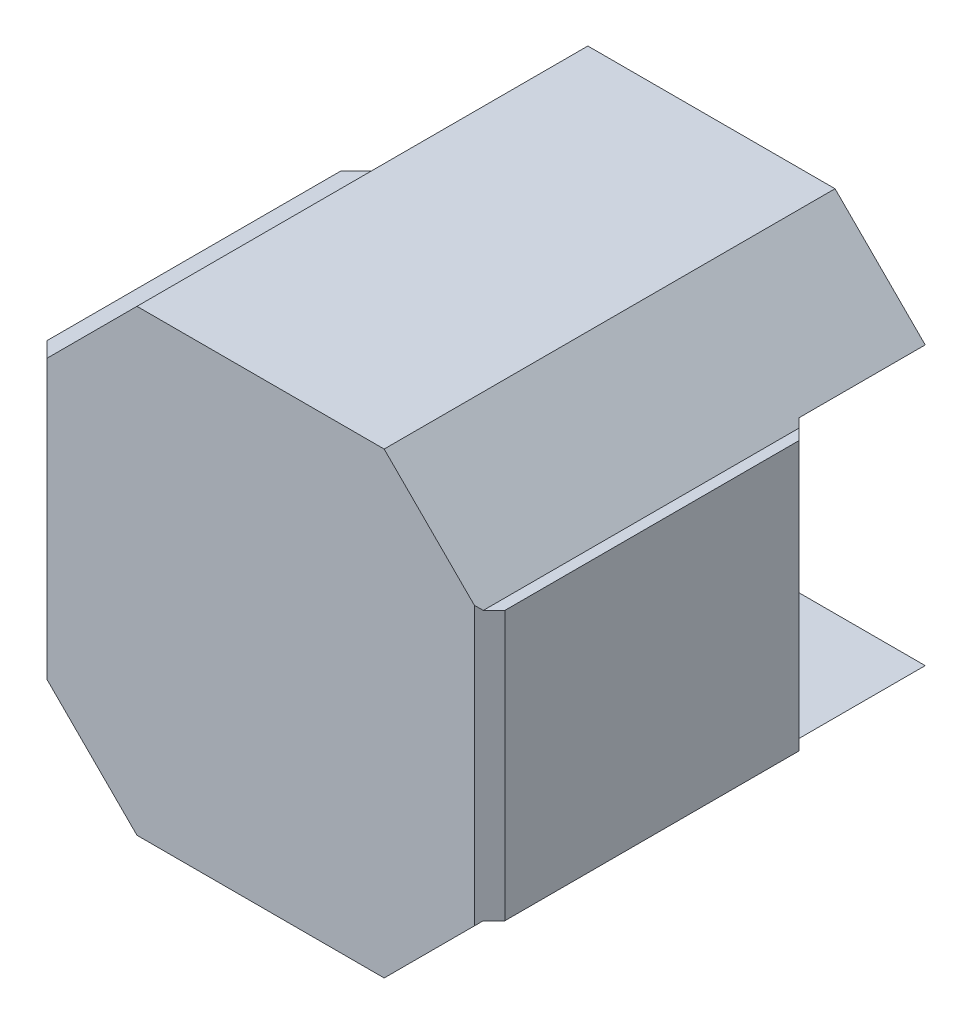
ISO-10303-21;
HEADER;
FILE_DESCRIPTION(('STEP AP214'),'2;1');
FILE_NAME('part.step','',(''),(''),'','','');
FILE_SCHEMA(('AUTOMOTIVE_DESIGN { 1 0 10303 214 1 1 1 1 }'));
ENDSEC;
DATA;
#1=APPLICATION_CONTEXT('core data for automotive mechanical design processes');
#2=APPLICATION_PROTOCOL_DEFINITION('international standard','automotive_design',2000,#1);
#3=PRODUCT_CONTEXT('',#1,'mechanical');
#4=PRODUCT('Part','Part','',(#3));
#5=PRODUCT_RELATED_PRODUCT_CATEGORY('part','',(#4));
#6=PRODUCT_DEFINITION_FORMATION('','',#4);
#7=PRODUCT_DEFINITION_CONTEXT('part definition',#1,'design');
#8=PRODUCT_DEFINITION('design','',#6,#7);
#9=PRODUCT_DEFINITION_SHAPE('','',#8);
#10=(LENGTH_UNIT() NAMED_UNIT(*) SI_UNIT(.MILLI.,.METRE.));
#11=(NAMED_UNIT(*) PLANE_ANGLE_UNIT() SI_UNIT($,.RADIAN.));
#12=(NAMED_UNIT(*) SI_UNIT($,.STERADIAN.) SOLID_ANGLE_UNIT());
#13=UNCERTAINTY_MEASURE_WITH_UNIT(LENGTH_MEASURE(1.E-05),#10,'distance_accuracy_value','');
#14=(GEOMETRIC_REPRESENTATION_CONTEXT(3) GLOBAL_UNCERTAINTY_ASSIGNED_CONTEXT((#13)) GLOBAL_UNIT_ASSIGNED_CONTEXT((#10,
#11,#12)) REPRESENTATION_CONTEXT('',''));
#15=CARTESIAN_POINT('',(0.,0.,0.));
#16=DIRECTION('',(0.,0.,1.));
#17=DIRECTION('',(1.,0.,0.));
#18=AXIS2_PLACEMENT_3D('',#15,#16,#17);
#19=CARTESIAN_POINT('',(1.21013162593085,-0.745201707402484,-0.001));
#20=DIRECTION('',(-9.58386862124118E-11,-1.,0.));
#21=DIRECTION('',(0.,0.,-1.));
#22=AXIS2_PLACEMENT_3D('',#19,#20,#21);
#23=PLANE('',#22);
#24=DIRECTION('',(-1.83149928177814E-11,0.,1.));
#25=VECTOR('',#24,1.);
#26=CARTESIAN_POINT('',(1.27000000001951,-0.745201707408222,-0.000999999998903511));
#27=LINE('',#26,#25);
#28=CARTESIAN_POINT('',(1.26999999997525,-0.745201707408222,2.41533333340944));
#29=VERTEX_POINT('',#28);
#30=CARTESIAN_POINT('',(1.27000000000512,-0.745201707411091,0.784666666660994));
#31=VERTEX_POINT('',#30);
#32=EDGE_CURVE('E838',#29,#31,#27,.F.);
#33=ORIENTED_EDGE('',*,*,#32,.F.);
#34=DIRECTION('',(-0.707106781186547,6.7768184920806E-11,0.707106781186548));
#35=VECTOR('',#34,1.);
#36=CARTESIAN_POINT('',(2.44823247965777,-0.745201707521142,1.23710085372692));
#37=LINE('',#36,#35);
#38=CARTESIAN_POINT('',(1.21013162593085,-0.745201707402484,2.47520170745384));
#39=VERTEX_POINT('',#38);
#40=EDGE_CURVE('E156',#39,#29,#37,.F.);
#41=ORIENTED_EDGE('',*,*,#40,.F.);
#42=DIRECTION('',(0.,0.,1.));
#43=VECTOR('',#42,1.);
#44=CARTESIAN_POINT('',(1.21013162593085,-0.745201707402484,2.41533333340944));
#45=LINE('',#44,#43);
#46=CARTESIAN_POINT('',(1.21013162593085,-0.745201707402484,0.724798292598206));
#47=VERTEX_POINT('',#46);
#48=EDGE_CURVE('E190',#47,#39,#45,.T.);
#49=ORIENTED_EDGE('',*,*,#48,.F.);
#50=DIRECTION('',(0.707106781254303,-6.77681849272996E-11,0.707106781118792));
#51=VECTOR('',#50,1.);
#52=CARTESIAN_POINT('',(0.847232479631749,-0.745201707367705,0.361899146368649));
#53=LINE('',#52,#51);
#54=EDGE_CURVE('E166',#31,#47,#53,.F.);
#55=ORIENTED_EDGE('',*,*,#54,.F.);
#56=EDGE_LOOP('',(#33,#41,#49,#55));
#57=FACE_BOUND('',#56,.T.);
#58=ADVANCED_FACE('F38',(#57),#23,.T.);
#59=CARTESIAN_POINT('',(1.21013162593085,0.745201707402485,-0.001));
#60=DIRECTION('',(-9.58332532829784E-11,1.,0.));
#61=DIRECTION('',(0.,0.,1.));
#62=AXIS2_PLACEMENT_3D('',#59,#60,#61);
#63=PLANE('',#62);
#64=DIRECTION('',(1.83149928177814E-11,0.,-1.));
#65=VECTOR('',#64,1.);
#66=CARTESIAN_POINT('',(1.27000000001951,0.745201707408222,-0.000999999998903511));
#67=LINE('',#66,#65);
#68=CARTESIAN_POINT('',(1.27000000000512,0.745201707408222,0.784666666660993));
#69=VERTEX_POINT('',#68);
#70=CARTESIAN_POINT('',(1.26999999997525,0.745201707408222,2.41533333340944));
#71=VERTEX_POINT('',#70);
#72=EDGE_CURVE('E12',#69,#71,#67,.F.);
#73=ORIENTED_EDGE('',*,*,#72,.F.);
#74=DIRECTION('',(-0.707106781254303,-6.77643432660552E-11,-0.707106781118792));
#75=VECTOR('',#74,1.);
#76=CARTESIAN_POINT('',(0.847232479631748,0.745201707367707,0.361899146368648));
#77=LINE('',#76,#75);
#78=CARTESIAN_POINT('',(1.21013162593085,0.745201707402485,0.724798292598203));
#79=VERTEX_POINT('',#78);
#80=EDGE_CURVE('E165',#79,#69,#77,.F.);
#81=ORIENTED_EDGE('',*,*,#80,.F.);
#82=DIRECTION('',(0.,0.,-1.));
#83=VECTOR('',#82,1.);
#84=CARTESIAN_POINT('',(1.21013162593085,0.745201707402485,0.784666666660995));
#85=LINE('',#84,#83);
#86=CARTESIAN_POINT('',(1.21013162593085,0.745201707402485,2.47520170745384));
#87=VERTEX_POINT('',#86);
#88=EDGE_CURVE('E164',#87,#79,#85,.T.);
#89=ORIENTED_EDGE('',*,*,#88,.F.);
#90=DIRECTION('',(0.707106781186547,6.77643432595619E-11,-0.707106781186548));
#91=VECTOR('',#90,1.);
#92=CARTESIAN_POINT('',(2.44823247965777,0.745201707521136,1.23710085372692));
#93=LINE('',#92,#91);
#94=EDGE_CURVE('E46',#71,#87,#93,.F.);
#95=ORIENTED_EDGE('',*,*,#94,.F.);
#96=EDGE_LOOP('',(#73,#81,#89,#95));
#97=FACE_BOUND('',#96,.T.);
#98=ADVANCED_FACE('F162',(#97),#63,.T.);
#99=CARTESIAN_POINT('',(1.18633333333116,-0.771,0.7));
#100=DIRECTION('',(0.,0.,-1.));
#101=DIRECTION('',(-1.,0.,0.));
#102=AXIS2_PLACEMENT_3D('',#99,#100,#101);
#103=PLANE('',#102);
#104=DIRECTION('',(1.,0.,0.));
#105=VECTOR('',#104,1.);
#106=CARTESIAN_POINT('',(1.18533333333333,-0.770000000000001,0.7));
#107=LINE('',#106,#105);
#108=CARTESIAN_POINT('',(-1.18533333333333,-0.77,0.7));
#109=VERTEX_POINT('',#108);
#110=CARTESIAN_POINT('',(1.18533333333333,-0.770000000000001,0.7));
#111=VERTEX_POINT('',#110);
#112=EDGE_CURVE('E836',#109,#111,#107,.T.);
#113=ORIENTED_EDGE('',*,*,#112,.F.);
#114=DIRECTION('',(0.,1.,0.));
#115=VECTOR('',#114,1.);
#116=CARTESIAN_POINT('',(-1.18533333341795,0.769999999999997,0.7));
#117=LINE('',#116,#115);
#118=CARTESIAN_POINT('',(-1.18533333333334,0.769999999999998,0.7));
#119=VERTEX_POINT('',#118);
#120=EDGE_CURVE('E178',#109,#119,#117,.T.);
#121=ORIENTED_EDGE('',*,*,#120,.T.);
#122=DIRECTION('',(-1.,0.,0.));
#123=VECTOR('',#122,1.);
#124=CARTESIAN_POINT('',(-1.18533333333334,0.769999999999998,0.7));
#125=LINE('',#124,#123);
#126=CARTESIAN_POINT('',(1.18533333333333,0.770000000000001,0.700000000002724));
#127=VERTEX_POINT('',#126);
#128=EDGE_CURVE('E789',#127,#119,#125,.T.);
#129=ORIENTED_EDGE('',*,*,#128,.F.);
#130=DIRECTION('',(0.,1.,0.));
#131=VECTOR('',#130,1.);
#132=CARTESIAN_POINT('',(1.18533333332789,0.,0.699999999999998));
#133=LINE('',#132,#131);
#134=EDGE_CURVE('E325',#111,#127,#133,.T.);
#135=ORIENTED_EDGE('',*,*,#134,.F.);
#136=EDGE_LOOP('',(#113,#121,#129,#135));
#137=FACE_BOUND('',#136,.T.);
#138=ADVANCED_FACE('F884',(#137),#103,.T.);
#139=CARTESIAN_POINT('',(-1.18633333341795,-1.271,2.5));
#140=DIRECTION('',(0.,0.,1.));
#141=DIRECTION('',(1.,0.,0.));
#142=AXIS2_PLACEMENT_3D('',#139,#140,#141);
#143=PLANE('',#142);
#144=DIRECTION('',(-0.707106781186547,-0.707106781186548,0.));
#145=VECTOR('',#144,1.);
#146=CARTESIAN_POINT('',(-0.685333333333333,1.27,2.50000000004231));
#147=LINE('',#146,#145);
#148=CARTESIAN_POINT('',(-0.685333333333333,1.27,2.50000000004231));
#149=VERTEX_POINT('',#148);
#150=CARTESIAN_POINT('',(-1.18533333333334,0.769999999999998,2.50000000004231));
#151=VERTEX_POINT('',#150);
#152=EDGE_CURVE('E792',#149,#151,#147,.T.);
#153=ORIENTED_EDGE('',*,*,#152,.T.);
#154=DIRECTION('',(0.,-1.,0.));
#155=VECTOR('',#154,1.);
#156=CARTESIAN_POINT('',(-1.18533333341795,-0.769999999999998,2.5));
#157=LINE('',#156,#155);
#158=CARTESIAN_POINT('',(-1.18533333333333,-0.77,2.50000000004231));
#159=VERTEX_POINT('',#158);
#160=EDGE_CURVE('E171',#151,#159,#157,.T.);
#161=ORIENTED_EDGE('',*,*,#160,.T.);
#162=DIRECTION('',(0.707106781186547,-0.707106781186548,0.));
#163=VECTOR('',#162,1.);
#164=CARTESIAN_POINT('',(-1.18533333333333,-0.77,2.50000000004231));
#165=LINE('',#164,#163);
#166=CARTESIAN_POINT('',(-0.685333333333333,-1.27,2.50000000004231));
#167=VERTEX_POINT('',#166);
#168=EDGE_CURVE('E812',#159,#167,#165,.T.);
#169=ORIENTED_EDGE('',*,*,#168,.T.);
#170=DIRECTION('',(1.,0.,0.));
#171=VECTOR('',#170,1.);
#172=CARTESIAN_POINT('',(-1.27,-1.27,2.5));
#173=LINE('',#172,#171);
#174=CARTESIAN_POINT('',(0.685333333333334,-1.27,2.5));
#175=VERTEX_POINT('',#174);
#176=EDGE_CURVE('E320',#167,#175,#173,.T.);
#177=ORIENTED_EDGE('',*,*,#176,.T.);
#178=DIRECTION('',(-0.707106781186547,-0.707106781186548,0.));
#179=VECTOR('',#178,1.);
#180=CARTESIAN_POINT('',(0.935333333333334,-1.02,2.5));
#181=LINE('',#180,#179);
#182=CARTESIAN_POINT('',(1.18533333335901,-0.769999999974321,2.50000000002569));
#183=VERTEX_POINT('',#182);
#184=EDGE_CURVE('E319',#183,#175,#181,.T.);
#185=ORIENTED_EDGE('',*,*,#184,.F.);
#186=DIRECTION('',(0.,-1.,0.));
#187=VECTOR('',#186,1.);
#188=CARTESIAN_POINT('',(1.1853333333847,0.,2.5));
#189=LINE('',#188,#187);
#190=CARTESIAN_POINT('',(1.18533333335901,0.769999999974318,2.50000000002568));
#191=VERTEX_POINT('',#190);
#192=EDGE_CURVE('E159',#191,#183,#189,.T.);
#193=ORIENTED_EDGE('',*,*,#192,.F.);
#194=DIRECTION('',(-0.707106781186545,0.70710678118655,0.));
#195=VECTOR('',#194,1.);
#196=CARTESIAN_POINT('',(1.18533333333333,0.77,2.5));
#197=LINE('',#196,#195);
#198=CARTESIAN_POINT('',(0.685333333333334,1.27,2.5));
#199=VERTEX_POINT('',#198);
#200=EDGE_CURVE('E202',#191,#199,#197,.T.);
#201=ORIENTED_EDGE('',*,*,#200,.T.);
#202=DIRECTION('',(1.,0.,0.));
#203=VECTOR('',#202,1.);
#204=CARTESIAN_POINT('',(-1.27,1.27,2.5));
#205=LINE('',#204,#203);
#206=EDGE_CURVE('E773',#149,#199,#205,.T.);
#207=ORIENTED_EDGE('',*,*,#206,.F.);
#208=EDGE_LOOP('',(#153,#161,#169,#177,#185,#193,#201,#207));
#209=FACE_BOUND('',#208,.T.);
#210=ADVANCED_FACE('F772',(#209),#143,.T.);
#211=CARTESIAN_POINT('',(1.18604044011452,0.769292893218814,-0.001));
#212=DIRECTION('',(0.70710678118655,0.707106781186545,0.));
#213=DIRECTION('',(-0.707106781186545,0.70710678118655,0.));
#214=AXIS2_PLACEMENT_3D('',#211,#212,#213);
#215=PLANE('',#214);
#216=DIRECTION('',(-0.577350269189624,0.577350269189628,0.577350269189625));
#217=VECTOR('',#216,1.);
#218=CARTESIAN_POINT('',(1.69852859549633,0.256804737837006,1.98680473788836));
#219=LINE('',#218,#217);
#220=EDGE_CURVE('E196',#191,#87,#219,.F.);
#221=ORIENTED_EDGE('',*,*,#220,.T.);
#222=ORIENTED_EDGE('',*,*,#88,.T.);
#223=DIRECTION('',(-0.577350269226506,0.57735026922651,-0.577350269115862));
#224=VECTOR('',#223,1.);
#225=CARTESIAN_POINT('',(0.952138071200633,1.0031952621327,0.466804737917428));
#226=LINE('',#225,#224);
#227=EDGE_CURVE('E193',#127,#79,#226,.F.);
#228=ORIENTED_EDGE('',*,*,#227,.F.);
#229=DIRECTION('',(0.,0.,1.));
#230=VECTOR('',#229,1.);
#231=CARTESIAN_POINT('',(1.18533333333333,0.770000000000001,-2.72351585728359E-12));
#232=LINE('',#231,#230);
#233=CARTESIAN_POINT('',(1.18533333333333,0.770000000000001,-2.72351585728359E-12));
#234=VERTEX_POINT('',#233);
#235=EDGE_CURVE('E786',#234,#127,#232,.T.);
#236=ORIENTED_EDGE('',*,*,#235,.F.);
#237=DIRECTION('',(0.707106781186545,-0.70710678118655,0.));
#238=VECTOR('',#237,1.);
#239=CARTESIAN_POINT('',(1.18533333333333,0.770000000000001,-2.72351585728359E-12));
#240=LINE('',#239,#238);
#241=CARTESIAN_POINT('',(0.685333333333335,1.27,-2.72351585728359E-12));
#242=VERTEX_POINT('',#241);
#243=EDGE_CURVE('E765',#242,#234,#240,.T.);
#244=ORIENTED_EDGE('',*,*,#243,.F.);
#245=DIRECTION('',(0.,0.,1.));
#246=VECTOR('',#245,1.);
#247=CARTESIAN_POINT('',(0.685333333333336,1.27,1.25));
#248=LINE('',#247,#246);
#249=EDGE_CURVE('E208',#242,#199,#248,.T.);
#250=ORIENTED_EDGE('',*,*,#249,.T.);
#251=ORIENTED_EDGE('',*,*,#200,.F.);
#252=EDGE_LOOP('',(#221,#222,#228,#236,#244,#250,#251));
#253=FACE_BOUND('',#252,.T.);
#254=ADVANCED_FACE('F761',(#253),#215,.T.);
#255=CARTESIAN_POINT('',(0.684626226552147,-1.27070710678119,-0.001));
#256=DIRECTION('',(0.707106781186548,-0.707106781186547,0.));
#257=DIRECTION('',(0.707106781186547,0.707106781186548,0.));
#258=AXIS2_PLACEMENT_3D('',#255,#256,#257);
#259=PLANE('',#258);
#260=DIRECTION('',(-0.577350269226507,-0.577350269226508,-0.577350269115863));
#261=VECTOR('',#260,1.);
#262=CARTESIAN_POINT('',(1.2419158489616,-0.713417484371736,0.756582515622863));
#263=LINE('',#262,#261);
#264=EDGE_CURVE('E198',#111,#47,#263,.F.);
#265=ORIENTED_EDGE('',*,*,#264,.T.);
#266=ORIENTED_EDGE('',*,*,#48,.T.);
#267=DIRECTION('',(-0.577350269189625,-0.577350269189626,0.577350269189626));
#268=VECTOR('',#267,1.);
#269=CARTESIAN_POINT('',(1.68519526216299,-0.27013807117034,2.00013807122169));
#270=LINE('',#269,#268);
#271=EDGE_CURVE('E158',#183,#39,#270,.F.);
#272=ORIENTED_EDGE('',*,*,#271,.F.);
#273=ORIENTED_EDGE('',*,*,#184,.T.);
#274=DIRECTION('',(0.,0.,-1.));
#275=VECTOR('',#274,1.);
#276=CARTESIAN_POINT('',(0.685333333333335,-1.27,1.25));
#277=LINE('',#276,#275);
#278=CARTESIAN_POINT('',(0.685333333333334,-1.27,-2.72351585728359E-12));
#279=VERTEX_POINT('',#278);
#280=EDGE_CURVE('E207',#175,#279,#277,.T.);
#281=ORIENTED_EDGE('',*,*,#280,.T.);
#282=DIRECTION('',(-0.707106781186546,-0.707106781186549,0.));
#283=VECTOR('',#282,1.);
#284=CARTESIAN_POINT('',(0.685333333333334,-1.27,-2.72351585728359E-12));
#285=LINE('',#284,#283);
#286=CARTESIAN_POINT('',(1.18533333333333,-0.770000000000001,-2.72351585728359E-12));
#287=VERTEX_POINT('',#286);
#288=EDGE_CURVE('E822',#287,#279,#285,.T.);
#289=ORIENTED_EDGE('',*,*,#288,.F.);
#290=DIRECTION('',(0.,0.,1.));
#291=VECTOR('',#290,1.);
#292=CARTESIAN_POINT('',(1.18533333333333,-0.770000000000001,-2.72351585728359E-12));
#293=LINE('',#292,#291);
#294=EDGE_CURVE('E830',#287,#111,#293,.T.);
#295=ORIENTED_EDGE('',*,*,#294,.T.);
#296=EDGE_LOOP('',(#265,#266,#272,#273,#281,#289,#295));
#297=FACE_BOUND('',#296,.T.);
#298=ADVANCED_FACE('F820',(#297),#259,.T.);
#299=CARTESIAN_POINT('',(1.27070710678125,-0.771,0.785373773436995));
#300=DIRECTION('',(0.707106781118792,0.,-0.707106781254303));
#301=DIRECTION('',(-0.707106781254303,0.,-0.707106781118792));
#302=AXIS2_PLACEMENT_3D('',#299,#300,#301);
#303=PLANE('',#302);
#304=ORIENTED_EDGE('',*,*,#134,.T.);
#305=ORIENTED_EDGE('',*,*,#227,.T.);
#306=ORIENTED_EDGE('',*,*,#80,.T.);
#307=DIRECTION('',(0.,1.,0.));
#308=VECTOR('',#307,1.);
#309=CARTESIAN_POINT('',(1.27000000000512,0.,0.784666666660993));
#310=LINE('',#309,#308);
#311=EDGE_CURVE('E52',#31,#69,#310,.T.);
#312=ORIENTED_EDGE('',*,*,#311,.F.);
#313=ORIENTED_EDGE('',*,*,#54,.T.);
#314=ORIENTED_EDGE('',*,*,#264,.F.);
#315=EDGE_LOOP('',(#304,#305,#306,#312,#313,#314));
#316=FACE_BOUND('',#315,.T.);
#317=ADVANCED_FACE('F777',(#316),#303,.T.);
#318=CARTESIAN_POINT('',(1.18462622657782,-0.771,2.50070710680687));
#319=DIRECTION('',(0.707106781186548,0.,0.707106781186547));
#320=DIRECTION('',(0.707106781186547,0.,-0.707106781186548));
#321=AXIS2_PLACEMENT_3D('',#318,#319,#320);
#322=PLANE('',#321);
#323=ORIENTED_EDGE('',*,*,#192,.T.);
#324=ORIENTED_EDGE('',*,*,#271,.T.);
#325=ORIENTED_EDGE('',*,*,#40,.T.);
#326=DIRECTION('',(0.,-1.,0.));
#327=VECTOR('',#326,1.);
#328=CARTESIAN_POINT('',(1.26999999997525,0.,2.41533333340944));
#329=LINE('',#328,#327);
#330=EDGE_CURVE('E148',#71,#29,#329,.T.);
#331=ORIENTED_EDGE('',*,*,#330,.F.);
#332=ORIENTED_EDGE('',*,*,#94,.T.);
#333=ORIENTED_EDGE('',*,*,#220,.F.);
#334=EDGE_LOOP('',(#323,#324,#325,#331,#332,#333));
#335=FACE_BOUND('',#334,.T.);
#336=ADVANCED_FACE('F154',(#335),#322,.T.);
#337=CARTESIAN_POINT('',(-1.27,-1.27,2.5));
#338=DIRECTION('',(0.,1.,0.));
#339=DIRECTION('',(0.,0.,1.));
#340=AXIS2_PLACEMENT_3D('',#337,#338,#339);
#341=PLANE('',#340);
#342=ORIENTED_EDGE('',*,*,#176,.F.);
#343=DIRECTION('',(0.,0.,-1.));
#344=VECTOR('',#343,1.);
#345=CARTESIAN_POINT('',(-0.685333333333333,-1.27,2.50000000004231));
#346=LINE('',#345,#344);
#347=CARTESIAN_POINT('',(-0.685333333333333,-1.27,-2.72351585728359E-12));
#348=VERTEX_POINT('',#347);
#349=EDGE_CURVE('E848',#167,#348,#346,.T.);
#350=ORIENTED_EDGE('',*,*,#349,.T.);
#351=DIRECTION('',(-1.,0.,0.));
#352=VECTOR('',#351,1.);
#353=CARTESIAN_POINT('',(-0.685333333333333,-1.27,-2.72351585728359E-12));
#354=LINE('',#353,#352);
#355=EDGE_CURVE('E817',#279,#348,#354,.T.);
#356=ORIENTED_EDGE('',*,*,#355,.F.);
#357=ORIENTED_EDGE('',*,*,#280,.F.);
#358=EDGE_LOOP('',(#342,#350,#356,#357));
#359=FACE_BOUND('',#358,.T.);
#360=ADVANCED_FACE('F815',(#359),#341,.F.);
#361=CARTESIAN_POINT('',(-1.27,1.27,0.7));
#362=DIRECTION('',(0.,-1.,0.));
#363=DIRECTION('',(0.,0.,-1.));
#364=AXIS2_PLACEMENT_3D('',#361,#362,#363);
#365=PLANE('',#364);
#366=ORIENTED_EDGE('',*,*,#249,.F.);
#367=DIRECTION('',(1.,0.,0.));
#368=VECTOR('',#367,1.);
#369=CARTESIAN_POINT('',(0.685333333333335,1.27,-2.72351585728359E-12));
#370=LINE('',#369,#368);
#371=CARTESIAN_POINT('',(-0.685333333333333,1.27,-2.72351585728359E-12));
#372=VERTEX_POINT('',#371);
#373=EDGE_CURVE('E797',#372,#242,#370,.T.);
#374=ORIENTED_EDGE('',*,*,#373,.F.);
#375=DIRECTION('',(0.,0.,-1.));
#376=VECTOR('',#375,1.);
#377=CARTESIAN_POINT('',(-0.685333333333333,1.27,2.50000000004231));
#378=LINE('',#377,#376);
#379=EDGE_CURVE('E795',#149,#372,#378,.T.);
#380=ORIENTED_EDGE('',*,*,#379,.F.);
#381=ORIENTED_EDGE('',*,*,#206,.T.);
#382=EDGE_LOOP('',(#366,#374,#380,#381));
#383=FACE_BOUND('',#382,.T.);
#384=ADVANCED_FACE('F860',(#383),#365,.F.);
#385=CARTESIAN_POINT('',(-1.27,0.,0.));
#386=DIRECTION('',(1.,0.,0.));
#387=DIRECTION('',(0.,0.,-1.));
#388=AXIS2_PLACEMENT_3D('',#385,#386,#387);
#389=PLANE('',#388);
#390=DIRECTION('',(0.,0.,-1.));
#391=VECTOR('',#390,1.);
#392=CARTESIAN_POINT('',(-1.27,0.770000000000002,2.50000000004231));
#393=LINE('',#392,#391);
#394=CARTESIAN_POINT('',(-1.27,0.770000000000002,2.41533333343418));
#395=VERTEX_POINT('',#394);
#396=CARTESIAN_POINT('',(-1.27,0.770000000000002,0.784666666565815));
#397=VERTEX_POINT('',#396);
#398=EDGE_CURVE('E801',#395,#397,#393,.T.);
#399=ORIENTED_EDGE('',*,*,#398,.T.);
#400=DIRECTION('',(0.,-1.,0.));
#401=VECTOR('',#400,1.);
#402=CARTESIAN_POINT('',(-1.27,-0.769999999999998,0.784666666565815));
#403=LINE('',#402,#401);
#404=CARTESIAN_POINT('',(-1.27,-0.769999999999998,0.784666666565815));
#405=VERTEX_POINT('',#404);
#406=EDGE_CURVE('E184',#397,#405,#403,.T.);
#407=ORIENTED_EDGE('',*,*,#406,.T.);
#408=DIRECTION('',(0.,0.,-1.));
#409=VECTOR('',#408,1.);
#410=CARTESIAN_POINT('',(-1.27,-0.769999999999998,2.50000000004231));
#411=LINE('',#410,#409);
#412=CARTESIAN_POINT('',(-1.27,-0.769999999999998,2.41533333343418));
#413=VERTEX_POINT('',#412);
#414=EDGE_CURVE('E845',#413,#405,#411,.T.);
#415=ORIENTED_EDGE('',*,*,#414,.F.);
#416=DIRECTION('',(0.,1.,0.));
#417=VECTOR('',#416,1.);
#418=CARTESIAN_POINT('',(-1.27,0.770000000000002,2.41533333343418));
#419=LINE('',#418,#417);
#420=EDGE_CURVE('E187',#413,#395,#419,.T.);
#421=ORIENTED_EDGE('',*,*,#420,.T.);
#422=EDGE_LOOP('',(#399,#407,#415,#421));
#423=FACE_BOUND('',#422,.T.);
#424=ADVANCED_FACE('F873',(#423),#389,.F.);
#425=CARTESIAN_POINT('',(-1.18533333333334,0.769999999999998,2.50000000004231));
#426=DIRECTION('',(0.,-1.,0.));
#427=DIRECTION('',(1.,0.,0.));
#428=AXIS2_PLACEMENT_3D('',#425,#426,#427);
#429=PLANE('',#428);
#430=DIRECTION('',(0.,0.,-1.));
#431=VECTOR('',#430,1.);
#432=CARTESIAN_POINT('',(-1.18533333333334,0.769999999999998,2.50000000004231));
#433=LINE('',#432,#431);
#434=EDGE_CURVE('E804',#151,#119,#433,.T.);
#435=ORIENTED_EDGE('',*,*,#434,.T.);
#436=DIRECTION('',(-0.707106781254321,0.,0.707106781118774));
#437=VECTOR('',#436,1.);
#438=CARTESIAN_POINT('',(-1.26999999999998,0.770000000000002,0.784666666565795));
#439=LINE('',#438,#437);
#440=EDGE_CURVE('E174',#119,#397,#439,.T.);
#441=ORIENTED_EDGE('',*,*,#440,.T.);
#442=ORIENTED_EDGE('',*,*,#398,.F.);
#443=DIRECTION('',(0.707106781254314,0.,0.707106781118781));
#444=VECTOR('',#443,1.);
#445=CARTESIAN_POINT('',(-1.26999999999998,0.770000000000002,2.4153333334342));
#446=LINE('',#445,#444);
#447=EDGE_CURVE('E176',#395,#151,#446,.T.);
#448=ORIENTED_EDGE('',*,*,#447,.T.);
#449=EDGE_LOOP('',(#435,#441,#442,#448));
#450=FACE_BOUND('',#449,.T.);
#451=ADVANCED_FACE('F918',(#450),#429,.F.);
#452=CARTESIAN_POINT('',(-0.685333333333333,1.27,2.50000000004231));
#453=DIRECTION('',(0.707106781186548,-0.707106781186547,0.));
#454=DIRECTION('',(0.707106781186547,0.707106781186548,0.));
#455=AXIS2_PLACEMENT_3D('',#452,#453,#454);
#456=PLANE('',#455);
#457=ORIENTED_EDGE('',*,*,#379,.T.);
#458=DIRECTION('',(0.707106781186547,0.707106781186548,0.));
#459=VECTOR('',#458,1.);
#460=CARTESIAN_POINT('',(-0.685333333333333,1.27,-2.72351585728359E-12));
#461=LINE('',#460,#459);
#462=CARTESIAN_POINT('',(-1.18533333333334,0.769999999999998,-2.72351585728359E-12));
#463=VERTEX_POINT('',#462);
#464=EDGE_CURVE('E854',#463,#372,#461,.T.);
#465=ORIENTED_EDGE('',*,*,#464,.F.);
#466=DIRECTION('',(0.,0.,1.));
#467=VECTOR('',#466,1.);
#468=CARTESIAN_POINT('',(-1.18533333333334,0.769999999999998,-2.72351585728359E-12));
#469=LINE('',#468,#467);
#470=EDGE_CURVE('E793',#463,#119,#469,.T.);
#471=ORIENTED_EDGE('',*,*,#470,.T.);
#472=ORIENTED_EDGE('',*,*,#434,.F.);
#473=ORIENTED_EDGE('',*,*,#152,.F.);
#474=EDGE_LOOP('',(#457,#465,#471,#472,#473));
#475=FACE_BOUND('',#474,.T.);
#476=ADVANCED_FACE('F862',(#475),#456,.F.);
#477=CARTESIAN_POINT('',(-1.18533333333334,0.769999999999998,-2.72351585728359E-12));
#478=DIRECTION('',(0.,1.,0.));
#479=DIRECTION('',(-1.,0.,0.));
#480=AXIS2_PLACEMENT_3D('',#477,#478,#479);
#481=PLANE('',#480);
#482=ORIENTED_EDGE('',*,*,#128,.T.);
#483=ORIENTED_EDGE('',*,*,#470,.F.);
#484=DIRECTION('',(-1.,0.,0.));
#485=VECTOR('',#484,1.);
#486=CARTESIAN_POINT('',(-1.18533333333334,0.769999999999998,-2.72351585728359E-12));
#487=LINE('',#486,#485);
#488=EDGE_CURVE('E791',#234,#463,#487,.T.);
#489=ORIENTED_EDGE('',*,*,#488,.F.);
#490=ORIENTED_EDGE('',*,*,#235,.T.);
#491=EDGE_LOOP('',(#482,#483,#489,#490));
#492=FACE_BOUND('',#491,.T.);
#493=ADVANCED_FACE('F787',(#492),#481,.F.);
#494=CARTESIAN_POINT('',(0.,0.,-2.72351585728359E-12));
#495=DIRECTION('',(0.,0.,1.));
#496=DIRECTION('',(1.,0.,0.));
#497=AXIS2_PLACEMENT_3D('',#494,#495,#496);
#498=PLANE('',#497);
#499=ORIENTED_EDGE('',*,*,#243,.T.);
#500=ORIENTED_EDGE('',*,*,#488,.T.);
#501=ORIENTED_EDGE('',*,*,#464,.T.);
#502=ORIENTED_EDGE('',*,*,#373,.T.);
#503=EDGE_LOOP('',(#499,#500,#501,#502));
#504=FACE_BOUND('',#503,.T.);
#505=ADVANCED_FACE('F858',(#504),#498,.F.);
#506=CARTESIAN_POINT('',(-1.27,-0.769999999999998,2.50000000004231));
#507=DIRECTION('',(0.,1.,0.));
#508=DIRECTION('',(-1.,0.,0.));
#509=AXIS2_PLACEMENT_3D('',#506,#507,#508);
#510=PLANE('',#509);
#511=ORIENTED_EDGE('',*,*,#414,.T.);
#512=DIRECTION('',(0.707106781254321,0.,-0.707106781118774));
#513=VECTOR('',#512,1.);
#514=CARTESIAN_POINT('',(-1.27000000000001,-0.769999999999998,0.784666666565826));
#515=LINE('',#514,#513);
#516=EDGE_CURVE('E180',#405,#109,#515,.T.);
#517=ORIENTED_EDGE('',*,*,#516,.T.);
#518=DIRECTION('',(0.,0.,-1.));
#519=VECTOR('',#518,1.);
#520=CARTESIAN_POINT('',(-1.18533333333333,-0.77,2.50000000004231));
#521=LINE('',#520,#519);
#522=EDGE_CURVE('E844',#159,#109,#521,.T.);
#523=ORIENTED_EDGE('',*,*,#522,.F.);
#524=DIRECTION('',(-0.707106781254314,0.,-0.707106781118781));
#525=VECTOR('',#524,1.);
#526=CARTESIAN_POINT('',(-1.27000000000001,-0.769999999999998,2.41533333343417));
#527=LINE('',#526,#525);
#528=EDGE_CURVE('E182',#159,#413,#527,.T.);
#529=ORIENTED_EDGE('',*,*,#528,.T.);
#530=EDGE_LOOP('',(#511,#517,#523,#529));
#531=FACE_BOUND('',#530,.T.);
#532=ADVANCED_FACE('F871',(#531),#510,.F.);
#533=CARTESIAN_POINT('',(-1.18533333333333,-0.77,2.50000000004231));
#534=DIRECTION('',(0.707106781186548,0.707106781186547,0.));
#535=DIRECTION('',(-0.707106781186547,0.707106781186548,0.));
#536=AXIS2_PLACEMENT_3D('',#533,#534,#535);
#537=PLANE('',#536);
#538=ORIENTED_EDGE('',*,*,#522,.T.);
#539=DIRECTION('',(0.,0.,1.));
#540=VECTOR('',#539,1.);
#541=CARTESIAN_POINT('',(-1.18533333333333,-0.77,-2.72351585728359E-12));
#542=LINE('',#541,#540);
#543=CARTESIAN_POINT('',(-1.18533333333333,-0.77,-2.72351585728359E-12));
#544=VERTEX_POINT('',#543);
#545=EDGE_CURVE('E840',#544,#109,#542,.T.);
#546=ORIENTED_EDGE('',*,*,#545,.F.);
#547=DIRECTION('',(-0.707106781186547,0.707106781186548,0.));
#548=VECTOR('',#547,1.);
#549=CARTESIAN_POINT('',(-1.18533333333333,-0.77,-2.72351585728359E-12));
#550=LINE('',#549,#548);
#551=EDGE_CURVE('E832',#348,#544,#550,.T.);
#552=ORIENTED_EDGE('',*,*,#551,.F.);
#553=ORIENTED_EDGE('',*,*,#349,.F.);
#554=ORIENTED_EDGE('',*,*,#168,.F.);
#555=EDGE_LOOP('',(#538,#546,#552,#553,#554));
#556=FACE_BOUND('',#555,.T.);
#557=ADVANCED_FACE('F885',(#556),#537,.F.);
#558=CARTESIAN_POINT('',(1.18533333333333,-0.770000000000001,-2.72351585728359E-12));
#559=DIRECTION('',(0.,-1.,0.));
#560=DIRECTION('',(1.,0.,0.));
#561=AXIS2_PLACEMENT_3D('',#558,#559,#560);
#562=PLANE('',#561);
#563=ORIENTED_EDGE('',*,*,#112,.T.);
#564=ORIENTED_EDGE('',*,*,#294,.F.);
#565=DIRECTION('',(1.,0.,0.));
#566=VECTOR('',#565,1.);
#567=CARTESIAN_POINT('',(1.18533333333333,-0.770000000000001,-2.72351585728359E-12));
#568=LINE('',#567,#566);
#569=EDGE_CURVE('E827',#544,#287,#568,.T.);
#570=ORIENTED_EDGE('',*,*,#569,.F.);
#571=ORIENTED_EDGE('',*,*,#545,.T.);
#572=EDGE_LOOP('',(#563,#564,#570,#571));
#573=FACE_BOUND('',#572,.T.);
#574=ADVANCED_FACE('F882',(#573),#562,.F.);
#575=CARTESIAN_POINT('',(0.,0.,-2.72351585728359E-12));
#576=DIRECTION('',(0.,0.,1.));
#577=DIRECTION('',(1.,0.,0.));
#578=AXIS2_PLACEMENT_3D('',#575,#576,#577);
#579=PLANE('',#578);
#580=ORIENTED_EDGE('',*,*,#551,.T.);
#581=ORIENTED_EDGE('',*,*,#569,.T.);
#582=ORIENTED_EDGE('',*,*,#288,.T.);
#583=ORIENTED_EDGE('',*,*,#355,.T.);
#584=EDGE_LOOP('',(#580,#581,#582,#583));
#585=FACE_BOUND('',#584,.T.);
#586=ADVANCED_FACE('F825',(#585),#579,.F.);
#587=CARTESIAN_POINT('',(-1.27,0.,0.784666666565815));
#588=DIRECTION('',(-0.707106781118774,0.,-0.707106781254321));
#589=DIRECTION('',(0.,1.,0.));
#590=AXIS2_PLACEMENT_3D('',#587,#588,#589);
#591=PLANE('',#590);
#592=ORIENTED_EDGE('',*,*,#440,.F.);
#593=ORIENTED_EDGE('',*,*,#120,.F.);
#594=ORIENTED_EDGE('',*,*,#516,.F.);
#595=ORIENTED_EDGE('',*,*,#406,.F.);
#596=EDGE_LOOP('',(#592,#593,#594,#595));
#597=FACE_BOUND('',#596,.T.);
#598=ADVANCED_FACE('F878',(#597),#591,.T.);
#599=CARTESIAN_POINT('',(-1.27,0.,2.41533333343418));
#600=DIRECTION('',(-0.707106781118781,0.,0.707106781254314));
#601=DIRECTION('',(0.,-1.,0.));
#602=AXIS2_PLACEMENT_3D('',#599,#600,#601);
#603=PLANE('',#602);
#604=ORIENTED_EDGE('',*,*,#528,.F.);
#605=ORIENTED_EDGE('',*,*,#160,.F.);
#606=ORIENTED_EDGE('',*,*,#447,.F.);
#607=ORIENTED_EDGE('',*,*,#420,.F.);
#608=EDGE_LOOP('',(#604,#605,#606,#607));
#609=FACE_BOUND('',#608,.T.);
#610=ADVANCED_FACE('F40',(#609),#603,.T.);
#611=CARTESIAN_POINT('',(1.27000000001949,0.,2.32600408789393E-11));
#612=DIRECTION('',(1.,0.,1.83149928177814E-11));
#613=DIRECTION('',(1.83149928177814E-11,0.,-1.));
#614=AXIS2_PLACEMENT_3D('',#611,#612,#613);
#615=PLANE('',#614);
#616=ORIENTED_EDGE('',*,*,#32,.T.);
#617=ORIENTED_EDGE('',*,*,#311,.T.);
#618=ORIENTED_EDGE('',*,*,#72,.T.);
#619=ORIENTED_EDGE('',*,*,#330,.T.);
#620=EDGE_LOOP('',(#616,#617,#618,#619));
#621=FACE_BOUND('',#620,.T.);
#622=ADVANCED_FACE('F147',(#621),#615,.T.);
#623=CLOSED_SHELL('',(#58,#98,#138,#210,#254,#298,#317,#336,#360,#384,#424,#451,#476,#493,#505,
#532,#557,#574,#586,#598,#610,#622));
#624=MANIFOLD_SOLID_BREP('B2',#623);
#625=ADVANCED_BREP_SHAPE_REPRESENTATION('',(#18,#624),#14);
#626=SHAPE_DEFINITION_REPRESENTATION(#9,#625);
ENDSEC;
END-ISO-10303-21;
